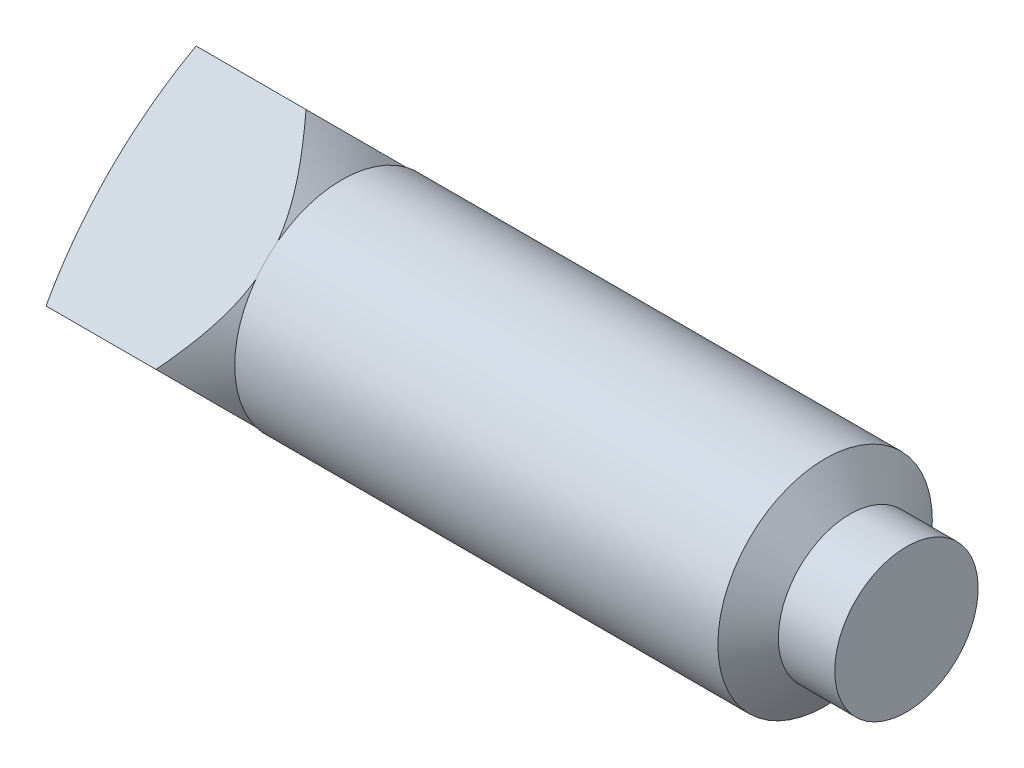
ISO-10303-21;
HEADER;
FILE_DESCRIPTION(('STEP AP214'),'2;1');
FILE_NAME('part.step','',(''),(''),'','','');
FILE_SCHEMA(('AUTOMOTIVE_DESIGN { 1 0 10303 214 1 1 1 1 }'));
ENDSEC;
DATA;
#1=APPLICATION_CONTEXT('core data for automotive mechanical design processes');
#2=APPLICATION_PROTOCOL_DEFINITION('international standard','automotive_design',2000,#1);
#3=PRODUCT_CONTEXT('',#1,'mechanical');
#4=PRODUCT('Part','Part','',(#3));
#5=PRODUCT_RELATED_PRODUCT_CATEGORY('part','',(#4));
#6=PRODUCT_DEFINITION_FORMATION('','',#4);
#7=PRODUCT_DEFINITION_CONTEXT('part definition',#1,'design');
#8=PRODUCT_DEFINITION('design','',#6,#7);
#9=PRODUCT_DEFINITION_SHAPE('','',#8);
#10=(LENGTH_UNIT() NAMED_UNIT(*) SI_UNIT(.MILLI.,.METRE.));
#11=(NAMED_UNIT(*) PLANE_ANGLE_UNIT() SI_UNIT($,.RADIAN.));
#12=(NAMED_UNIT(*) SI_UNIT($,.STERADIAN.) SOLID_ANGLE_UNIT());
#13=UNCERTAINTY_MEASURE_WITH_UNIT(LENGTH_MEASURE(1.E-05),#10,'distance_accuracy_value','');
#14=(GEOMETRIC_REPRESENTATION_CONTEXT(3) GLOBAL_UNCERTAINTY_ASSIGNED_CONTEXT((#13)) GLOBAL_UNIT_ASSIGNED_CONTEXT((#10,
#11,#12)) REPRESENTATION_CONTEXT('',''));
#15=CARTESIAN_POINT('',(0.,0.,0.));
#16=DIRECTION('',(0.,0.,1.));
#17=DIRECTION('',(1.,0.,0.));
#18=AXIS2_PLACEMENT_3D('',#15,#16,#17);
#19=CARTESIAN_POINT('',(-3.7592,0.,-3.376576301522));
#20=DIRECTION('',(0.,-0.707106781186549,0.707106781186546));
#21=DIRECTION('',(0.,-0.707106781186546,-0.707106781186549));
#22=AXIS2_PLACEMENT_3D('',#19,#20,#21);
#23=PLANE('',#22);
#24=CARTESIAN_POINT('',(-3.71463670391965,-2.84404188134766,-6.22061818286968));
#25=CARTESIAN_POINT('',(-3.55613835738031,-2.7014684863289,-6.07804478785091));
#26=CARTESIAN_POINT('',(-3.3981461725614,-2.55860959219922,-5.93518589372124));
#27=CARTESIAN_POINT('',(-3.08363247371533,-2.27203984223068,-5.64861614375269));
#28=CARTESIAN_POINT('',(-2.92711125800507,-2.12832882282158,-5.50490512434359));
#29=CARTESIAN_POINT('',(-2.61537743727245,-1.83919610910249,-5.2157724106245));
#30=CARTESIAN_POINT('',(-2.46017361078745,-1.69376967166462,-5.07034597318663));
#31=CARTESIAN_POINT('',(-2.15261018150915,-1.40143979481068,-4.77801609633269));
#32=CARTESIAN_POINT('',(-2.00025026783184,-1.25453651956937,-4.63111282109139));
#33=CARTESIAN_POINT('',(-1.72970912218957,-0.988182083810127,-4.36475838533214));
#34=CARTESIAN_POINT('',(-1.6107818963044,-0.869111186157921,-4.24568748767993));
#35=CARTESIAN_POINT('',(-1.37665028006823,-0.629105226352269,-4.00568152787428));
#36=CARTESIAN_POINT('',(-1.2614467785999,-0.508169729132242,-3.88474603065425));
#37=CARTESIAN_POINT('',(-1.03648369877529,-0.263755950580114,-3.64033225210212));
#38=CARTESIAN_POINT('',(-0.92672420864868,-0.140277628082976,-3.51685392960498));
#39=CARTESIAN_POINT('',(-0.768411771757097,0.0475823268502128,-3.32899397467179));
#40=CARTESIAN_POINT('',(-0.716703508322019,0.110632006865489,-3.26594429465652));
#41=CARTESIAN_POINT('',(-0.615958235242697,0.237786165781802,-3.13879013574021));
#42=CARTESIAN_POINT('',(-0.566920935267894,0.301890529049748,-3.07468577247226));
#43=CARTESIAN_POINT('',(-0.470564396194465,0.433616769365347,-2.94295953215666));
#44=CARTESIAN_POINT('',(-0.423365899696167,0.501283129317186,-2.87529317220482));
#45=CARTESIAN_POINT('',(-0.333664681644449,0.638144262361111,-2.73843203916089));
#46=CARTESIAN_POINT('',(-0.291160483356159,0.707338546531602,-2.6692377549904));
#47=CARTESIAN_POINT('',(-0.21229503205601,0.847303910790577,-2.52927239073143));
#48=CARTESIAN_POINT('',(-0.175920709426421,0.918071262430309,-2.4585050390917));
#49=CARTESIAN_POINT('',(-0.110910569940002,1.06137320930863,-2.31520309221337));
#50=CARTESIAN_POINT('',(-0.0822720790273502,1.1339071844,-2.24266911712201));
#51=CARTESIAN_POINT('',(-0.0393755590361009,1.26582470943116,-2.11075159209084));
#52=CARTESIAN_POINT('',(-0.0233846612610308,1.3249242803964,-2.0516520211256));
#53=CARTESIAN_POINT('',(0.00161538214945519,1.44386018912426,-1.93271611239775));
#54=CARTESIAN_POINT('',(0.0106258990169595,1.50369637983728,-1.87287992168472));
#55=CARTESIAN_POINT('',(0.021092065218137,1.62355655088552,-1.75301975063648));
#56=CARTESIAN_POINT('',(0.0225662852538797,1.68357970456736,-1.69299659695464));
#57=CARTESIAN_POINT('',(0.0179155629650262,1.80348109631527,-1.57309520520673));
#58=CARTESIAN_POINT('',(0.0117896392073187,1.86335931466481,-1.51321698685719));
#59=CARTESIAN_POINT('',(-0.0100815229762292,1.99721927704997,-1.37935702447203));
#60=CARTESIAN_POINT('',(-0.0278264770273225,2.0710373829424,-1.3055389185796));
#61=CARTESIAN_POINT('',(-0.0730208692286304,2.21718932171448,-1.15938697980752));
#62=CARTESIAN_POINT('',(-0.100477023648013,2.28952209061009,-1.08705421091191));
#63=CARTESIAN_POINT('',(-0.147658550765419,2.39694211918635,-0.97963418233565));
#64=CARTESIAN_POINT('',(-0.164455634065146,2.43269379192945,-0.943882509592546));
#65=CARTESIAN_POINT('',(-0.199813441042728,2.50374093804669,-0.872835363475312));
#66=CARTESIAN_POINT('',(-0.218373328077738,2.5390366188918,-0.837539682630196));
#67=CARTESIAN_POINT('',(-0.257053416617419,2.60919264030523,-0.76738366121677));
#68=CARTESIAN_POINT('',(-0.277173505655796,2.64405301204262,-0.73252328947938));
#69=CARTESIAN_POINT('',(-0.318791320846267,2.71336326090944,-0.663213040612556));
#70=CARTESIAN_POINT('',(-0.340289202341572,2.74781309123005,-0.628763210291943));
#71=CARTESIAN_POINT('',(-0.403215402660216,2.84534321177683,-0.53123308974517));
#72=CARTESIAN_POINT('',(-0.446099723650993,2.90795472792718,-0.468621573594819));
#73=CARTESIAN_POINT('',(-0.535121543723205,3.0320152226666,-0.344561078855395));
#74=CARTESIAN_POINT('',(-0.581259746295179,3.09346394619477,-0.283112355327228));
#75=CARTESIAN_POINT('',(-0.723571645103524,3.27639274740935,-0.100183554112644));
#76=CARTESIAN_POINT('',(-0.823588743807233,3.39637526634611,0.0197989648241122));
#77=CARTESIAN_POINT('',(-1.03047356134526,3.63375592705897,0.257179625536972));
#78=CARTESIAN_POINT('',(-1.13735948771658,3.75114599014641,0.374569688624415));
#79=CARTESIAN_POINT('',(-1.35557896678493,3.9837660355182,0.607189733996207));
#80=CARTESIAN_POINT('',(-1.4669107776858,4.09899683825346,0.722420536731465));
#81=CARTESIAN_POINT('',(-1.69305612145307,4.3282350269933,0.951658725471309));
#82=CARTESIAN_POINT('',(-1.8078789629881,4.44223779677309,1.06566149525109));
#83=CARTESIAN_POINT('',(-2.03983717113582,4.66907271742696,1.29249641590497));
#84=CARTESIAN_POINT('',(-2.1569727351054,4.78190476713299,1.405328465611));
#85=CARTESIAN_POINT('',(-2.39279712471298,5.00650286499349,1.6299265634715));
#86=CARTESIAN_POINT('',(-2.51148349733182,5.11827020377589,1.7416939022539));
#87=CARTESIAN_POINT('',(-2.75017246375155,5.34109999204909,1.9645236905271));
#88=CARTESIAN_POINT('',(-2.87017506440569,5.45216243786494,2.07558613634295));
#89=CARTESIAN_POINT('',(-3.05068333501779,5.61808795816659,2.2415116566446));
#90=CARTESIAN_POINT('',(-3.11080136898793,5.67316227632004,2.29658597479806));
#91=CARTESIAN_POINT('',(-3.23127854688802,5.78319708269411,2.40662078117212));
#92=CARTESIAN_POINT('',(-3.29163773795283,5.83815754511766,2.46158124359567));
#93=CARTESIAN_POINT('',(-3.41233885436048,5.94776482135319,2.5711885198312));
#94=CARTESIAN_POINT('',(-3.47268003281208,6.00241204656935,2.62583574504737));
#95=CARTESIAN_POINT('',(-3.59353260813616,6.11159399323992,2.73501769171794));
#96=CARTESIAN_POINT('',(-3.65404396700814,6.16612873572371,2.78955243420173));
#97=CARTESIAN_POINT('',(-3.71463670391965,6.22061818286967,2.84404188134769));
#98=B_SPLINE_CURVE_WITH_KNOTS('',3,(#24,#25,#26,#27,#28,#29,#30,#31,#32,#33,#34,#35,#36,#37,#38,
#39,#40,#41,#42,#43,#44,#45,#46,#47,#48,#49,#50,#51,#52,#53,#54,#55,#56,#57,#58,#59,#60,#61,#62,
#63,#64,#65,#66,#67,#68,#69,#70,#71,#72,#73,#74,#75,#76,#77,#78,#79,#80,#81,#82,#83,#84,#85,#86,
#87,#88,#89,#90,#91,#92,#93,#94,#95,#96,#97),.UNSPECIFIED.,.F.,.F.,(4,2,2,2,2,2,2,2,2,2,2,2,2,2,
2,2,2,2,2,2,2,2,2,2,2,2,2,2,2,2,2,2,2,2,2,2,4),(0.,0.769411594985047,1.53897600020603,
2.31192373762504,3.08478647901891,3.70321119591575,4.32178246157398,4.94036374898194,
5.24955145783678,5.55870549100784,5.87871228162845,6.19861811586593,6.51783299840494,
6.83693739586921,7.0919662684174,7.3469450301599,7.60129517747026,7.8556781733224,
8.17279662746614,8.49013483105985,8.64994152137471,8.80967274140049,8.96939245797432,
9.12913021439977,9.42418817492744,9.71931012383282,10.3099299987715,10.9021857726158,
11.4942117478058,12.0879855523368,12.6818102476394,13.2747881880489,13.8677692174057,
14.1629380958073,14.4581678026877,14.7523159011579,15.0464028402099),.UNSPECIFIED.);
#99=CARTESIAN_POINT('',(-0.808536519218278,0.,-3.376576301522));
#100=VERTEX_POINT('',#99);
#101=CARTESIAN_POINT('',(0.,1.44137193015166,-1.93520437137034));
#102=VERTEX_POINT('',#101);
#103=EDGE_CURVE('E159',#100,#102,#98,.T.);
#104=ORIENTED_EDGE('',*,*,#103,.F.);
#105=DIRECTION('',(1.,0.,0.));
#106=VECTOR('',#105,1.);
#107=CARTESIAN_POINT('',(-3.7592,0.,-3.376576301522));
#108=LINE('',#107,#106);
#109=CARTESIAN_POINT('',(-3.2823012150984,0.,-3.376576301522));
#110=VERTEX_POINT('',#109);
#111=EDGE_CURVE('E140',#110,#100,#108,.T.);
#112=ORIENTED_EDGE('',*,*,#111,.F.);
#113=CARTESIAN_POINT('',(8.4328,1.688288150761,-1.688288150761));
#114=DIRECTION('',(0.,-0.707106781186549,0.707106781186546));
#115=DIRECTION('',(0.,-0.707106781186546,-0.707106781186549));
#116=AXIS2_PLACEMENT_3D('',#113,#114,#115);
#117=CIRCLE('',#116,11.9559286648926);
#118=CARTESIAN_POINT('',(-3.2823012150984,3.376576301522,0.));
#119=VERTEX_POINT('',#118);
#120=EDGE_CURVE('E149',#119,#110,#117,.T.);
#121=ORIENTED_EDGE('',*,*,#120,.F.);
#122=DIRECTION('',(1.,0.,0.));
#123=VECTOR('',#122,1.);
#124=CARTESIAN_POINT('',(-3.7592,3.376576301522,0.));
#125=LINE('',#124,#123);
#126=CARTESIAN_POINT('',(-0.808536519218278,3.376576301522,0.));
#127=VERTEX_POINT('',#126);
#128=EDGE_CURVE('E147',#119,#127,#125,.T.);
#129=ORIENTED_EDGE('',*,*,#128,.T.);
#130=CARTESIAN_POINT('',(0.,1.93520437137034,-1.44137193015166));
#131=VERTEX_POINT('',#130);
#132=EDGE_CURVE('E169',#131,#127,#98,.T.);
#133=ORIENTED_EDGE('',*,*,#132,.F.);
#134=DIRECTION('',(0.,-0.707106781186546,-0.707106781186549));
#135=VECTOR('',#134,1.);
#136=CARTESIAN_POINT('',(0.,0.,-3.376576301522));
#137=LINE('',#136,#135);
#138=EDGE_CURVE('E40',#131,#102,#137,.T.);
#139=ORIENTED_EDGE('',*,*,#138,.T.);
#140=EDGE_LOOP('',(#104,#112,#121,#129,#133,#139));
#141=FACE_BOUND('',#140,.T.);
#142=ADVANCED_FACE('F32',(#141),#23,.F.);
#143=CARTESIAN_POINT('',(-3.7592,0.,-3.376576301522));
#144=DIRECTION('',(0.,0.707106781186546,0.707106781186549));
#145=DIRECTION('',(0.,-0.707106781186549,0.707106781186546));
#146=AXIS2_PLACEMENT_3D('',#143,#144,#145);
#147=PLANE('',#146);
#148=CARTESIAN_POINT('',(-3.71463670391965,-6.22061818286968,2.84404188134766));
#149=CARTESIAN_POINT('',(-3.55613835738031,-6.07804478785091,2.7014684863289));
#150=CARTESIAN_POINT('',(-3.3981461725614,-5.93518589372124,2.55860959219923));
#151=CARTESIAN_POINT('',(-3.08363247371533,-5.64861614375269,2.27203984223068));
#152=CARTESIAN_POINT('',(-2.92711125800507,-5.50490512434359,2.12832882282158));
#153=CARTESIAN_POINT('',(-2.61537743727245,-5.2157724106245,1.83919610910249));
#154=CARTESIAN_POINT('',(-2.46017361078745,-5.07034597318663,1.69376967166462));
#155=CARTESIAN_POINT('',(-2.15261018150915,-4.77801609633269,1.40143979481068));
#156=CARTESIAN_POINT('',(-2.00025026783184,-4.63111282109139,1.25453651956937));
#157=CARTESIAN_POINT('',(-1.72970912218957,-4.36475838533214,0.988182083810127));
#158=CARTESIAN_POINT('',(-1.6107818963044,-4.24568748767993,0.869111186157921));
#159=CARTESIAN_POINT('',(-1.37665028006823,-4.00568152787428,0.629105226352268));
#160=CARTESIAN_POINT('',(-1.2614467785999,-3.88474603065425,0.508169729132241));
#161=CARTESIAN_POINT('',(-1.03648369877529,-3.64033225210212,0.263755950580114));
#162=CARTESIAN_POINT('',(-0.92672420864868,-3.51685392960498,0.140277628082975));
#163=CARTESIAN_POINT('',(-0.768411771757097,-3.32899397467179,-0.0475823268502131));
#164=CARTESIAN_POINT('',(-0.716703508322019,-3.26594429465652,-0.11063200686549));
#165=CARTESIAN_POINT('',(-0.615958235242697,-3.13879013574021,-0.237786165781802));
#166=CARTESIAN_POINT('',(-0.566920935267894,-3.07468577247226,-0.301890529049748));
#167=CARTESIAN_POINT('',(-0.470564396194465,-2.94295953215666,-0.433616769365348));
#168=CARTESIAN_POINT('',(-0.423365899696167,-2.87529317220482,-0.501283129317186));
#169=CARTESIAN_POINT('',(-0.333664681644449,-2.73843203916089,-0.638144262361111));
#170=CARTESIAN_POINT('',(-0.291160483356159,-2.6692377549904,-0.707338546531602));
#171=CARTESIAN_POINT('',(-0.21229503205601,-2.52927239073143,-0.847303910790577));
#172=CARTESIAN_POINT('',(-0.175920709426422,-2.4585050390917,-0.918071262430309));
#173=CARTESIAN_POINT('',(-0.110910569940002,-2.31520309221337,-1.06137320930863));
#174=CARTESIAN_POINT('',(-0.0822720790273506,-2.24266911712201,-1.1339071844));
#175=CARTESIAN_POINT('',(-0.0393755590361008,-2.11075159209084,-1.26582470943116));
#176=CARTESIAN_POINT('',(-0.0233846612610302,-2.0516520211256,-1.3249242803964));
#177=CARTESIAN_POINT('',(0.00161538214945554,-1.93271611239775,-1.44386018912426));
#178=CARTESIAN_POINT('',(0.0106258990169592,-1.87287992168472,-1.50369637983728));
#179=CARTESIAN_POINT('',(0.0210920652181363,-1.75301975063648,-1.62355655088552));
#180=CARTESIAN_POINT('',(0.0225662852538793,-1.69299659695464,-1.68357970456736));
#181=CARTESIAN_POINT('',(0.0179155629650258,-1.57309520520673,-1.80348109631527));
#182=CARTESIAN_POINT('',(0.0117896392073179,-1.51321698685719,-1.86335931466481));
#183=CARTESIAN_POINT('',(-0.01008152297623,-1.37935702447203,-1.99721927704998));
#184=CARTESIAN_POINT('',(-0.0278264770273229,-1.3055389185796,-2.0710373829424));
#185=CARTESIAN_POINT('',(-0.0730208692286305,-1.15938697980752,-2.21718932171448));
#186=CARTESIAN_POINT('',(-0.100477023648013,-1.08705421091191,-2.28952209061009));
#187=CARTESIAN_POINT('',(-0.14765855076542,-0.97963418233565,-2.39694211918635));
#188=CARTESIAN_POINT('',(-0.164455634065146,-0.943882509592546,-2.43269379192945));
#189=CARTESIAN_POINT('',(-0.199813441042728,-0.872835363475312,-2.50374093804669));
#190=CARTESIAN_POINT('',(-0.218373328077739,-0.837539682630195,-2.5390366188918));
#191=CARTESIAN_POINT('',(-0.25705341661742,-0.767383661216768,-2.60919264030523));
#192=CARTESIAN_POINT('',(-0.277173505655796,-0.732523289479379,-2.64405301204262));
#193=CARTESIAN_POINT('',(-0.318791320846268,-0.663213040612556,-2.71336326090944));
#194=CARTESIAN_POINT('',(-0.340289202341573,-0.628763210291943,-2.74781309123006));
#195=CARTESIAN_POINT('',(-0.403215402660216,-0.53123308974517,-2.84534321177683));
#196=CARTESIAN_POINT('',(-0.446099723650993,-0.46862157359482,-2.90795472792718));
#197=CARTESIAN_POINT('',(-0.535121543723204,-0.344561078855395,-3.0320152226666));
#198=CARTESIAN_POINT('',(-0.581259746295178,-0.283112355327229,-3.09346394619477));
#199=CARTESIAN_POINT('',(-0.723571645103523,-0.100183554112645,-3.27639274740935));
#200=CARTESIAN_POINT('',(-0.823588743807233,0.0197989648241119,-3.39637526634611));
#201=CARTESIAN_POINT('',(-1.03047356134526,0.257179625536973,-3.63375592705897));
#202=CARTESIAN_POINT('',(-1.13735948771658,0.374569688624416,-3.75114599014641));
#203=CARTESIAN_POINT('',(-1.35557896678493,0.607189733996208,-3.9837660355182));
#204=CARTESIAN_POINT('',(-1.4669107776858,0.722420536731466,-4.09899683825346));
#205=CARTESIAN_POINT('',(-1.69305612145307,0.951658725471309,-4.3282350269933));
#206=CARTESIAN_POINT('',(-1.8078789629881,1.0656614952511,-4.44223779677309));
#207=CARTESIAN_POINT('',(-2.03983717113582,1.29249641590497,-4.66907271742696));
#208=CARTESIAN_POINT('',(-2.1569727351054,1.405328465611,-4.78190476713299));
#209=CARTESIAN_POINT('',(-2.39279712471298,1.6299265634715,-5.00650286499349));
#210=CARTESIAN_POINT('',(-2.51148349733182,1.7416939022539,-5.11827020377589));
#211=CARTESIAN_POINT('',(-2.75017246375155,1.9645236905271,-5.34109999204909));
#212=CARTESIAN_POINT('',(-2.87017506440569,2.07558613634295,-5.45216243786494));
#213=CARTESIAN_POINT('',(-3.05068333501779,2.2415116566446,-5.61808795816659));
#214=CARTESIAN_POINT('',(-3.11080136898793,2.29658597479806,-5.67316227632004));
#215=CARTESIAN_POINT('',(-3.23127854688802,2.40662078117212,-5.78319708269411));
#216=CARTESIAN_POINT('',(-3.29163773795283,2.46158124359567,-5.83815754511766));
#217=CARTESIAN_POINT('',(-3.41233885436048,2.5711885198312,-5.94776482135319));
#218=CARTESIAN_POINT('',(-3.47268003281208,2.62583574504737,-6.00241204656935));
#219=CARTESIAN_POINT('',(-3.59353260813616,2.73501769171794,-6.11159399323992));
#220=CARTESIAN_POINT('',(-3.65404396700814,2.78955243420173,-6.16612873572371));
#221=CARTESIAN_POINT('',(-3.71463670391965,2.84404188134769,-6.22061818286967));
#222=B_SPLINE_CURVE_WITH_KNOTS('',3,(#148,#149,#150,#151,#152,#153,#154,#155,#156,#157,#158,
#159,#160,#161,#162,#163,#164,#165,#166,#167,#168,#169,#170,#171,#172,#173,#174,#175,#176,#177,
#178,#179,#180,#181,#182,#183,#184,#185,#186,#187,#188,#189,#190,#191,#192,#193,#194,#195,#196,
#197,#198,#199,#200,#201,#202,#203,#204,#205,#206,#207,#208,#209,#210,#211,#212,#213,#214,#215,
#216,#217,#218,#219,#220,#221),.UNSPECIFIED.,.F.,.F.,(4,2,2,2,2,2,2,2,2,2,2,2,2,2,2,2,2,2,2,2,2,
2,2,2,2,2,2,2,2,2,2,2,2,2,2,2,4),(0.,0.769411594985047,1.53897600020603,2.31192373762504,
3.08478647901891,3.70321119591575,4.32178246157398,4.94036374898194,5.24955145783678,
5.55870549100784,5.87871228162845,6.19861811586593,6.51783299840494,6.83693739586921,
7.0919662684174,7.3469450301599,7.60129517747026,7.8556781733224,8.17279662746614,
8.49013483105985,8.64994152137472,8.80967274140049,8.96939245797432,9.12913021439978,
9.42418817492744,9.71931012383282,10.3099299987715,10.9021857726158,11.4942117478058,
12.0879855523368,12.6818102476394,13.2747881880489,13.8677692174057,14.1629380958073,
14.4581678026877,14.7523159011579,15.0464028402099),.UNSPECIFIED.);
#223=CARTESIAN_POINT('',(-0.808536519218278,-3.376576301522,0.));
#224=VERTEX_POINT('',#223);
#225=CARTESIAN_POINT('',(0.,-1.93520437137034,-1.44137193015166));
#226=VERTEX_POINT('',#225);
#227=EDGE_CURVE('E160',#224,#226,#222,.T.);
#228=ORIENTED_EDGE('',*,*,#227,.F.);
#229=DIRECTION('',(1.,0.,0.));
#230=VECTOR('',#229,1.);
#231=CARTESIAN_POINT('',(-3.7592,-3.376576301522,0.));
#232=LINE('',#231,#230);
#233=CARTESIAN_POINT('',(-3.2823012150984,-3.376576301522,0.));
#234=VERTEX_POINT('',#233);
#235=EDGE_CURVE('E143',#234,#224,#232,.T.);
#236=ORIENTED_EDGE('',*,*,#235,.F.);
#237=CARTESIAN_POINT('',(8.4328,-1.688288150761,-1.688288150761));
#238=DIRECTION('',(0.,0.707106781186546,0.707106781186549));
#239=DIRECTION('',(0.,-0.707106781186549,0.707106781186546));
#240=AXIS2_PLACEMENT_3D('',#237,#238,#239);
#241=CIRCLE('',#240,11.9559286648926);
#242=EDGE_CURVE('E156',#110,#234,#241,.T.);
#243=ORIENTED_EDGE('',*,*,#242,.F.);
#244=ORIENTED_EDGE('',*,*,#111,.T.);
#245=CARTESIAN_POINT('',(0.,-1.44137193015166,-1.93520437137034));
#246=VERTEX_POINT('',#245);
#247=EDGE_CURVE('E167',#246,#100,#222,.T.);
#248=ORIENTED_EDGE('',*,*,#247,.F.);
#249=DIRECTION('',(0.,-0.707106781186549,0.707106781186546));
#250=VECTOR('',#249,1.);
#251=CARTESIAN_POINT('',(0.,0.,-3.376576301522));
#252=LINE('',#251,#250);
#253=EDGE_CURVE('E127',#246,#226,#252,.T.);
#254=ORIENTED_EDGE('',*,*,#253,.T.);
#255=EDGE_LOOP('',(#228,#236,#243,#244,#248,#254));
#256=FACE_BOUND('',#255,.T.);
#257=ADVANCED_FACE('F175',(#256),#147,.F.);
#258=CARTESIAN_POINT('',(-3.7592,-3.376576301522,0.));
#259=DIRECTION('',(0.,0.707106781186549,-0.707106781186546));
#260=DIRECTION('',(0.,0.707106781186546,0.707106781186549));
#261=AXIS2_PLACEMENT_3D('',#258,#259,#260);
#262=PLANE('',#261);
#263=CARTESIAN_POINT('',(-3.71463670391965,2.84404188134766,6.22061818286968));
#264=CARTESIAN_POINT('',(-3.55613835738031,2.70146848632889,6.07804478785091));
#265=CARTESIAN_POINT('',(-3.3981461725614,2.55860959219922,5.93518589372124));
#266=CARTESIAN_POINT('',(-3.08363247371533,2.27203984223068,5.64861614375269));
#267=CARTESIAN_POINT('',(-2.92711125800507,2.12832882282158,5.50490512434359));
#268=CARTESIAN_POINT('',(-2.61537743727245,1.83919610910249,5.2157724106245));
#269=CARTESIAN_POINT('',(-2.46017361078745,1.69376967166462,5.07034597318663));
#270=CARTESIAN_POINT('',(-2.15261018150915,1.40143979481067,4.77801609633269));
#271=CARTESIAN_POINT('',(-2.00025026783184,1.25453651956937,4.63111282109139));
#272=CARTESIAN_POINT('',(-1.72970912218957,0.988182083810127,4.36475838533214));
#273=CARTESIAN_POINT('',(-1.6107818963044,0.869111186157921,4.24568748767993));
#274=CARTESIAN_POINT('',(-1.37665028006823,0.629105226352269,4.00568152787428));
#275=CARTESIAN_POINT('',(-1.2614467785999,0.508169729132241,3.88474603065425));
#276=CARTESIAN_POINT('',(-1.03648369877529,0.263755950580114,3.64033225210212));
#277=CARTESIAN_POINT('',(-0.926724208648679,0.140277628082975,3.51685392960498));
#278=CARTESIAN_POINT('',(-0.768411771757096,-0.0475823268502135,3.32899397467179));
#279=CARTESIAN_POINT('',(-0.716703508322018,-0.11063200686549,3.26594429465652));
#280=CARTESIAN_POINT('',(-0.615958235242696,-0.237786165781802,3.1387901357402));
#281=CARTESIAN_POINT('',(-0.566920935267893,-0.301890529049749,3.07468577247226));
#282=CARTESIAN_POINT('',(-0.470564396194464,-0.433616769365348,2.94295953215666));
#283=CARTESIAN_POINT('',(-0.423365899696167,-0.501283129317187,2.87529317220482));
#284=CARTESIAN_POINT('',(-0.333664681644448,-0.638144262361113,2.73843203916089));
#285=CARTESIAN_POINT('',(-0.291160483356158,-0.707338546531603,2.6692377549904));
#286=CARTESIAN_POINT('',(-0.212295032056009,-0.847303910790578,2.52927239073143));
#287=CARTESIAN_POINT('',(-0.175920709426421,-0.91807126243031,2.4585050390917));
#288=CARTESIAN_POINT('',(-0.110910569940002,-1.06137320930863,2.31520309221337));
#289=CARTESIAN_POINT('',(-0.0822720790273505,-1.1339071844,2.24266911712201));
#290=CARTESIAN_POINT('',(-0.0393755590361012,-1.26582470943116,2.11075159209084));
#291=CARTESIAN_POINT('',(-0.0233846612610307,-1.3249242803964,2.0516520211256));
#292=CARTESIAN_POINT('',(0.00161538214945534,-1.44386018912426,1.93271611239775));
#293=CARTESIAN_POINT('',(0.0106258990169595,-1.50369637983728,1.87287992168472));
#294=CARTESIAN_POINT('',(0.0210920652181365,-1.62355655088552,1.75301975063648));
#295=CARTESIAN_POINT('',(0.0225662852538791,-1.68357970456736,1.69299659695464));
#296=CARTESIAN_POINT('',(0.0179155629650254,-1.80348109631527,1.57309520520673));
#297=CARTESIAN_POINT('',(0.0117896392073179,-1.86335931466481,1.51321698685719));
#298=CARTESIAN_POINT('',(-0.0100815229762297,-1.99721927704998,1.37935702447203));
#299=CARTESIAN_POINT('',(-0.0278264770273227,-2.0710373829424,1.3055389185796));
#300=CARTESIAN_POINT('',(-0.0730208692286305,-2.21718932171448,1.15938697980752));
#301=CARTESIAN_POINT('',(-0.100477023648013,-2.28952209061009,1.08705421091191));
#302=CARTESIAN_POINT('',(-0.14765855076542,-2.39694211918635,0.979634182335649));
#303=CARTESIAN_POINT('',(-0.164455634065147,-2.43269379192945,0.943882509592545));
#304=CARTESIAN_POINT('',(-0.199813441042729,-2.50374093804669,0.872835363475312));
#305=CARTESIAN_POINT('',(-0.218373328077739,-2.5390366188918,0.837539682630195));
#306=CARTESIAN_POINT('',(-0.257053416617421,-2.60919264030523,0.767383661216768));
#307=CARTESIAN_POINT('',(-0.277173505655797,-2.64405301204262,0.732523289479378));
#308=CARTESIAN_POINT('',(-0.318791320846268,-2.71336326090944,0.663213040612555));
#309=CARTESIAN_POINT('',(-0.340289202341573,-2.74781309123006,0.628763210291942));
#310=CARTESIAN_POINT('',(-0.403215402660217,-2.84534321177683,0.531233089745169));
#311=CARTESIAN_POINT('',(-0.446099723650993,-2.90795472792718,0.468621573594818));
#312=CARTESIAN_POINT('',(-0.535121543723206,-3.0320152226666,0.344561078855393));
#313=CARTESIAN_POINT('',(-0.58125974629518,-3.09346394619477,0.283112355327227));
#314=CARTESIAN_POINT('',(-0.723571645103525,-3.27639274740935,0.100183554112643));
#315=CARTESIAN_POINT('',(-0.823588743807235,-3.39637526634611,-0.019798964824114));
#316=CARTESIAN_POINT('',(-1.03047356134526,-3.63375592705897,-0.257179625536975));
#317=CARTESIAN_POINT('',(-1.13735948771658,-3.75114599014641,-0.374569688624418));
#318=CARTESIAN_POINT('',(-1.35557896678493,-3.98376603551821,-0.607189733996212));
#319=CARTESIAN_POINT('',(-1.4669107776858,-4.09899683825346,-0.72242053673147));
#320=CARTESIAN_POINT('',(-1.69305612145307,-4.32823502699331,-0.951658725471313));
#321=CARTESIAN_POINT('',(-1.80787896298811,-4.44223779677309,-1.0656614952511));
#322=CARTESIAN_POINT('',(-2.03983717113582,-4.66907271742697,-1.29249641590498));
#323=CARTESIAN_POINT('',(-2.1569727351054,-4.78190476713299,-1.405328465611));
#324=CARTESIAN_POINT('',(-2.39279712471299,-5.0065028649935,-1.62992656347151));
#325=CARTESIAN_POINT('',(-2.51148349733183,-5.11827020377589,-1.74169390225391));
#326=CARTESIAN_POINT('',(-2.75017246375156,-5.3410999920491,-1.96452369052711));
#327=CARTESIAN_POINT('',(-2.8701750644057,-5.45216243786495,-2.07558613634296));
#328=CARTESIAN_POINT('',(-3.05068333501779,-5.6180879581666,-2.24151165664461));
#329=CARTESIAN_POINT('',(-3.11080136898793,-5.67316227632005,-2.29658597479806));
#330=CARTESIAN_POINT('',(-3.23127854688803,-5.78319708269411,-2.40662078117212));
#331=CARTESIAN_POINT('',(-3.29163773795283,-5.83815754511766,-2.46158124359568));
#332=CARTESIAN_POINT('',(-3.41233885436048,-5.94776482135319,-2.57118851983121));
#333=CARTESIAN_POINT('',(-3.47268003281208,-6.00241204656936,-2.62583574504737));
#334=CARTESIAN_POINT('',(-3.59353260813617,-6.11159399323992,-2.73501769171794));
#335=CARTESIAN_POINT('',(-3.65404396700814,-6.16612873572371,-2.78955243420173));
#336=CARTESIAN_POINT('',(-3.71463670391965,-6.22061818286967,-2.84404188134769));
#337=B_SPLINE_CURVE_WITH_KNOTS('',3,(#263,#264,#265,#266,#267,#268,#269,#270,#271,#272,#273,
#274,#275,#276,#277,#278,#279,#280,#281,#282,#283,#284,#285,#286,#287,#288,#289,#290,#291,#292,
#293,#294,#295,#296,#297,#298,#299,#300,#301,#302,#303,#304,#305,#306,#307,#308,#309,#310,#311,
#312,#313,#314,#315,#316,#317,#318,#319,#320,#321,#322,#323,#324,#325,#326,#327,#328,#329,#330,
#331,#332,#333,#334,#335,#336),.UNSPECIFIED.,.F.,.F.,(4,2,2,2,2,2,2,2,2,2,2,2,2,2,2,2,2,2,2,2,2,
2,2,2,2,2,2,2,2,2,2,2,2,2,2,2,4),(0.,0.769411594985047,1.53897600020603,2.31192373762504,
3.08478647901891,3.70321119591575,4.32178246157398,4.94036374898194,5.24955145783678,
5.55870549100784,5.87871228162846,6.19861811586593,6.51783299840494,6.83693739586921,
7.0919662684174,7.34694503015991,7.60129517747026,7.8556781733224,8.17279662746614,
8.49013483105985,8.64994152137472,8.80967274140049,8.96939245797432,9.12913021439978,
9.42418817492744,9.71931012383283,10.3099299987715,10.9021857726158,11.4942117478058,
12.0879855523368,12.6818102476394,13.2747881880489,13.8677692174058,14.1629380958074,
14.4581678026877,14.7523159011579,15.0464028402099),.UNSPECIFIED.);
#338=CARTESIAN_POINT('',(-0.808536519218278,0.,3.376576301522));
#339=VERTEX_POINT('',#338);
#340=CARTESIAN_POINT('',(0.,-1.44137193015166,1.93520437137034));
#341=VERTEX_POINT('',#340);
#342=EDGE_CURVE('E54',#339,#341,#337,.T.);
#343=ORIENTED_EDGE('',*,*,#342,.F.);
#344=DIRECTION('',(1.,0.,0.));
#345=VECTOR('',#344,1.);
#346=CARTESIAN_POINT('',(-3.7592,0.,3.376576301522));
#347=LINE('',#346,#345);
#348=CARTESIAN_POINT('',(-3.2823012150984,0.,3.376576301522));
#349=VERTEX_POINT('',#348);
#350=EDGE_CURVE('E115',#349,#339,#347,.T.);
#351=ORIENTED_EDGE('',*,*,#350,.F.);
#352=CARTESIAN_POINT('',(8.4328,-1.688288150761,1.688288150761));
#353=DIRECTION('',(0.,0.707106781186549,-0.707106781186546));
#354=DIRECTION('',(0.,0.707106781186546,0.707106781186549));
#355=AXIS2_PLACEMENT_3D('',#352,#353,#354);
#356=CIRCLE('',#355,11.9559286648926);
#357=EDGE_CURVE('E46',#234,#349,#356,.T.);
#358=ORIENTED_EDGE('',*,*,#357,.F.);
#359=ORIENTED_EDGE('',*,*,#235,.T.);
#360=CARTESIAN_POINT('',(0.,-1.93520437137034,1.44137193015166));
#361=VERTEX_POINT('',#360);
#362=EDGE_CURVE('E168',#361,#224,#337,.T.);
#363=ORIENTED_EDGE('',*,*,#362,.F.);
#364=DIRECTION('',(0.,0.707106781186546,0.707106781186549));
#365=VECTOR('',#364,1.);
#366=CARTESIAN_POINT('',(0.,-3.376576301522,0.));
#367=LINE('',#366,#365);
#368=EDGE_CURVE('E121',#361,#341,#367,.T.);
#369=ORIENTED_EDGE('',*,*,#368,.T.);
#370=EDGE_LOOP('',(#343,#351,#358,#359,#363,#369));
#371=FACE_BOUND('',#370,.T.);
#372=ADVANCED_FACE('F196',(#371),#262,.F.);
#373=CARTESIAN_POINT('',(-3.7592,3.376576301522,0.));
#374=DIRECTION('',(0.,-0.707106781186546,-0.707106781186549));
#375=DIRECTION('',(0.,0.707106781186549,-0.707106781186546));
#376=AXIS2_PLACEMENT_3D('',#373,#374,#375);
#377=PLANE('',#376);
#378=CARTESIAN_POINT('',(-3.71463670391965,6.22061818286968,-2.84404188134766));
#379=CARTESIAN_POINT('',(-3.55613835738031,6.07804478785091,-2.70146848632889));
#380=CARTESIAN_POINT('',(-3.3981461725614,5.93518589372124,-2.55860959219922));
#381=CARTESIAN_POINT('',(-3.08363247371533,5.64861614375269,-2.27203984223068));
#382=CARTESIAN_POINT('',(-2.92711125800507,5.50490512434359,-2.12832882282158));
#383=CARTESIAN_POINT('',(-2.61537743727245,5.2157724106245,-1.83919610910249));
#384=CARTESIAN_POINT('',(-2.46017361078745,5.07034597318663,-1.69376967166462));
#385=CARTESIAN_POINT('',(-2.15261018150916,4.77801609633269,-1.40143979481068));
#386=CARTESIAN_POINT('',(-2.00025026783184,4.63111282109139,-1.25453651956937));
#387=CARTESIAN_POINT('',(-1.72970912218957,4.36475838533214,-0.988182083810127));
#388=CARTESIAN_POINT('',(-1.6107818963044,4.24568748767993,-0.869111186157921));
#389=CARTESIAN_POINT('',(-1.37665028006823,4.00568152787428,-0.629105226352269));
#390=CARTESIAN_POINT('',(-1.2614467785999,3.88474603065425,-0.508169729132241));
#391=CARTESIAN_POINT('',(-1.03648369877529,3.64033225210212,-0.263755950580114));
#392=CARTESIAN_POINT('',(-0.926724208648679,3.51685392960498,-0.140277628082975));
#393=CARTESIAN_POINT('',(-0.768411771757096,3.32899397467179,0.0475823268502137));
#394=CARTESIAN_POINT('',(-0.716703508322018,3.26594429465652,0.110632006865491));
#395=CARTESIAN_POINT('',(-0.615958235242696,3.1387901357402,0.237786165781803));
#396=CARTESIAN_POINT('',(-0.566920935267893,3.07468577247226,0.301890529049749));
#397=CARTESIAN_POINT('',(-0.470564396194464,2.94295953215666,0.433616769365348));
#398=CARTESIAN_POINT('',(-0.423365899696167,2.87529317220482,0.501283129317187));
#399=CARTESIAN_POINT('',(-0.333664681644448,2.73843203916089,0.638144262361112));
#400=CARTESIAN_POINT('',(-0.291160483356158,2.6692377549904,0.707338546531603));
#401=CARTESIAN_POINT('',(-0.212295032056009,2.52927239073143,0.847303910790578));
#402=CARTESIAN_POINT('',(-0.175920709426421,2.45850503909169,0.91807126243031));
#403=CARTESIAN_POINT('',(-0.110910569940001,2.31520309221337,1.06137320930863));
#404=CARTESIAN_POINT('',(-0.0822720790273496,2.24266911712201,1.1339071844));
#405=CARTESIAN_POINT('',(-0.0393755590361004,2.11075159209084,1.26582470943116));
#406=CARTESIAN_POINT('',(-0.0233846612610304,2.0516520211256,1.3249242803964));
#407=CARTESIAN_POINT('',(0.00161538214945541,1.93271611239775,1.44386018912426));
#408=CARTESIAN_POINT('',(0.0106258990169596,1.87287992168472,1.50369637983728));
#409=CARTESIAN_POINT('',(0.0210920652181369,1.75301975063648,1.62355655088552));
#410=CARTESIAN_POINT('',(0.0225662852538796,1.69299659695464,1.68357970456736));
#411=CARTESIAN_POINT('',(0.0179155629650259,1.57309520520673,1.80348109631527));
#412=CARTESIAN_POINT('',(0.0117896392073183,1.51321698685719,1.86335931466481));
#413=CARTESIAN_POINT('',(-0.0100815229762296,1.37935702447203,1.99721927704998));
#414=CARTESIAN_POINT('',(-0.0278264770273229,1.3055389185796,2.0710373829424));
#415=CARTESIAN_POINT('',(-0.0730208692286305,1.15938697980752,2.21718932171448));
#416=CARTESIAN_POINT('',(-0.100477023648013,1.08705421091191,2.28952209061009));
#417=CARTESIAN_POINT('',(-0.14765855076542,0.979634182335649,2.39694211918635));
#418=CARTESIAN_POINT('',(-0.164455634065147,0.943882509592545,2.43269379192945));
#419=CARTESIAN_POINT('',(-0.199813441042729,0.872835363475311,2.50374093804669));
#420=CARTESIAN_POINT('',(-0.218373328077739,0.837539682630194,2.5390366188918));
#421=CARTESIAN_POINT('',(-0.25705341661742,0.767383661216768,2.60919264030523));
#422=CARTESIAN_POINT('',(-0.277173505655797,0.732523289479378,2.64405301204262));
#423=CARTESIAN_POINT('',(-0.318791320846268,0.663213040612555,2.71336326090944));
#424=CARTESIAN_POINT('',(-0.340289202341573,0.628763210291942,2.74781309123006));
#425=CARTESIAN_POINT('',(-0.403215402660217,0.531233089745169,2.84534321177683));
#426=CARTESIAN_POINT('',(-0.446099723650994,0.468621573594818,2.90795472792718));
#427=CARTESIAN_POINT('',(-0.535121543723206,0.344561078855393,3.0320152226666));
#428=CARTESIAN_POINT('',(-0.58125974629518,0.283112355327226,3.09346394619477));
#429=CARTESIAN_POINT('',(-0.723571645103525,0.100183554112641,3.27639274740935));
#430=CARTESIAN_POINT('',(-0.823588743807236,-0.0197989648241155,3.39637526634611));
#431=CARTESIAN_POINT('',(-1.03047356134526,-0.257179625536976,3.63375592705897));
#432=CARTESIAN_POINT('',(-1.13735948771658,-0.37456968862442,3.75114599014641));
#433=CARTESIAN_POINT('',(-1.35557896678493,-0.607189733996213,3.98376603551821));
#434=CARTESIAN_POINT('',(-1.4669107776858,-0.72242053673147,4.09899683825346));
#435=CARTESIAN_POINT('',(-1.69305612145307,-0.951658725471314,4.32823502699331));
#436=CARTESIAN_POINT('',(-1.80787896298811,-1.0656614952511,4.44223779677309));
#437=CARTESIAN_POINT('',(-2.03983717113582,-1.29249641590498,4.66907271742697));
#438=CARTESIAN_POINT('',(-2.1569727351054,-1.405328465611,4.78190476713299));
#439=CARTESIAN_POINT('',(-2.39279712471299,-1.62992656347151,5.0065028649935));
#440=CARTESIAN_POINT('',(-2.51148349733183,-1.74169390225391,5.1182702037759));
#441=CARTESIAN_POINT('',(-2.75017246375156,-1.96452369052711,5.3410999920491));
#442=CARTESIAN_POINT('',(-2.8701750644057,-2.07558613634296,5.45216243786495));
#443=CARTESIAN_POINT('',(-3.0506833350178,-2.24151165664461,5.6180879581666));
#444=CARTESIAN_POINT('',(-3.11080136898793,-2.29658597479806,5.67316227632005));
#445=CARTESIAN_POINT('',(-3.23127854688803,-2.40662078117213,5.78319708269411));
#446=CARTESIAN_POINT('',(-3.29163773795283,-2.46158124359568,5.83815754511766));
#447=CARTESIAN_POINT('',(-3.41233885436048,-2.57118851983121,5.94776482135319));
#448=CARTESIAN_POINT('',(-3.47268003281208,-2.62583574504737,6.00241204656936));
#449=CARTESIAN_POINT('',(-3.59353260813617,-2.73501769171794,6.11159399323992));
#450=CARTESIAN_POINT('',(-3.65404396700814,-2.78955243420173,6.16612873572371));
#451=CARTESIAN_POINT('',(-3.71463670391965,-2.84404188134769,6.22061818286967));
#452=B_SPLINE_CURVE_WITH_KNOTS('',3,(#378,#379,#380,#381,#382,#383,#384,#385,#386,#387,#388,
#389,#390,#391,#392,#393,#394,#395,#396,#397,#398,#399,#400,#401,#402,#403,#404,#405,#406,#407,
#408,#409,#410,#411,#412,#413,#414,#415,#416,#417,#418,#419,#420,#421,#422,#423,#424,#425,#426,
#427,#428,#429,#430,#431,#432,#433,#434,#435,#436,#437,#438,#439,#440,#441,#442,#443,#444,#445,
#446,#447,#448,#449,#450,#451),.UNSPECIFIED.,.F.,.F.,(4,2,2,2,2,2,2,2,2,2,2,2,2,2,2,2,2,2,2,2,2,
2,2,2,2,2,2,2,2,2,2,2,2,2,2,2,4),(0.,0.769411594985047,1.53897600020603,2.31192373762504,
3.08478647901891,3.70321119591575,4.32178246157398,4.94036374898194,5.24955145783678,
5.55870549100784,5.87871228162846,6.19861811586593,6.51783299840494,6.83693739586921,
7.0919662684174,7.34694503015991,7.60129517747026,7.8556781733224,8.17279662746614,
8.49013483105985,8.64994152137472,8.80967274140049,8.96939245797433,9.12913021439978,
9.42418817492745,9.71931012383283,10.3099299987716,10.9021857726158,11.4942117478059,
12.0879855523368,12.6818102476394,13.2747881880489,13.8677692174058,14.1629380958074,
14.4581678026877,14.752315901158,15.0464028402099),.UNSPECIFIED.);
#453=CARTESIAN_POINT('',(0.,1.93520437137034,1.44137193015166));
#454=VERTEX_POINT('',#453);
#455=EDGE_CURVE('E117',#127,#454,#452,.T.);
#456=ORIENTED_EDGE('',*,*,#455,.F.);
#457=ORIENTED_EDGE('',*,*,#128,.F.);
#458=CARTESIAN_POINT('',(8.4328,1.688288150761,1.688288150761));
#459=DIRECTION('',(0.,-0.707106781186546,-0.707106781186549));
#460=DIRECTION('',(0.,0.707106781186549,-0.707106781186546));
#461=AXIS2_PLACEMENT_3D('',#458,#459,#460);
#462=CIRCLE('',#461,11.9559286648926);
#463=EDGE_CURVE('E11',#349,#119,#462,.T.);
#464=ORIENTED_EDGE('',*,*,#463,.F.);
#465=ORIENTED_EDGE('',*,*,#350,.T.);
#466=CARTESIAN_POINT('',(0.,1.44137193015166,1.93520437137034));
#467=VERTEX_POINT('',#466);
#468=EDGE_CURVE('E99',#467,#339,#452,.T.);
#469=ORIENTED_EDGE('',*,*,#468,.F.);
#470=DIRECTION('',(0.,0.707106781186549,-0.707106781186546));
#471=VECTOR('',#470,1.);
#472=CARTESIAN_POINT('',(0.,3.376576301522,0.));
#473=LINE('',#472,#471);
#474=EDGE_CURVE('E113',#467,#454,#473,.T.);
#475=ORIENTED_EDGE('',*,*,#474,.T.);
#476=EDGE_LOOP('',(#456,#457,#464,#465,#469,#475));
#477=FACE_BOUND('',#476,.T.);
#478=ADVANCED_FACE('F112',(#477),#377,.F.);
#479=CARTESIAN_POINT('',(0.,0.,0.));
#480=DIRECTION('',(-1.,0.,0.));
#481=DIRECTION('',(0.,0.,1.));
#482=AXIS2_PLACEMENT_3D('',#479,#480,#481);
#483=PLANE('',#482);
#484=ORIENTED_EDGE('',*,*,#138,.F.);
#485=CARTESIAN_POINT('',(0.,0.,0.));
#486=DIRECTION('',(-1.,0.,0.));
#487=DIRECTION('',(0.,0.,1.));
#488=AXIS2_PLACEMENT_3D('',#485,#486,#487);
#489=CIRCLE('',#488,2.413);
#490=EDGE_CURVE('E130',#131,#102,#489,.T.);
#491=ORIENTED_EDGE('',*,*,#490,.T.);
#492=EDGE_LOOP('',(#484,#491));
#493=FACE_BOUND('',#492,.T.);
#494=ADVANCED_FACE('F202',(#493),#483,.T.);
#495=ORIENTED_EDGE('',*,*,#474,.F.);
#496=EDGE_CURVE('E106',#467,#454,#489,.T.);
#497=ORIENTED_EDGE('',*,*,#496,.T.);
#498=EDGE_LOOP('',(#495,#497));
#499=FACE_BOUND('',#498,.T.);
#500=ADVANCED_FACE('F120',(#499),#483,.T.);
#501=ORIENTED_EDGE('',*,*,#368,.F.);
#502=EDGE_CURVE('E104',#361,#341,#489,.T.);
#503=ORIENTED_EDGE('',*,*,#502,.T.);
#504=EDGE_LOOP('',(#501,#503));
#505=FACE_BOUND('',#504,.T.);
#506=ADVANCED_FACE('F232',(#505),#483,.T.);
#507=ORIENTED_EDGE('',*,*,#253,.F.);
#508=EDGE_CURVE('E245',#246,#226,#489,.T.);
#509=ORIENTED_EDGE('',*,*,#508,.T.);
#510=EDGE_LOOP('',(#507,#509));
#511=FACE_BOUND('',#510,.T.);
#512=ADVANCED_FACE('F34',(#511),#483,.T.);
#513=CARTESIAN_POINT('',(0.,0.,0.));
#514=DIRECTION('',(-1.,0.,0.));
#515=DIRECTION('',(0.,0.,1.));
#516=AXIS2_PLACEMENT_3D('',#513,#514,#515);
#517=CYLINDRICAL_SURFACE('',#516,2.413);
#518=CARTESIAN_POINT('',(10.8697639486784,0.,0.));
#519=DIRECTION('',(-1.,0.,0.));
#520=DIRECTION('',(0.,0.,1.));
#521=AXIS2_PLACEMENT_3D('',#518,#519,#520);
#522=CIRCLE('',#521,2.413);
#523=CARTESIAN_POINT('',(10.8697639486784,0.,2.413));
#524=VERTEX_POINT('',#523);
#525=EDGE_CURVE('E105',#524,#524,#522,.T.);
#526=ORIENTED_EDGE('',*,*,#525,.T.);
#527=EDGE_LOOP('',(#526));
#528=FACE_BOUND('',#527,.T.);
#529=ORIENTED_EDGE('',*,*,#496,.F.);
#530=EDGE_CURVE('E96',#341,#467,#489,.T.);
#531=ORIENTED_EDGE('',*,*,#530,.F.);
#532=ORIENTED_EDGE('',*,*,#502,.F.);
#533=EDGE_CURVE('E252',#226,#361,#489,.T.);
#534=ORIENTED_EDGE('',*,*,#533,.F.);
#535=ORIENTED_EDGE('',*,*,#508,.F.);
#536=EDGE_CURVE('E250',#102,#246,#489,.T.);
#537=ORIENTED_EDGE('',*,*,#536,.F.);
#538=ORIENTED_EDGE('',*,*,#490,.F.);
#539=EDGE_CURVE('E126',#454,#131,#489,.T.);
#540=ORIENTED_EDGE('',*,*,#539,.F.);
#541=EDGE_LOOP('',(#529,#531,#532,#534,#535,#537,#538,#540));
#542=FACE_BOUND('',#541,.T.);
#543=ADVANCED_FACE('F124',(#528,#542),#517,.T.);
#544=CARTESIAN_POINT('',(11.43,0.,0.));
#545=DIRECTION('',(-1.,0.,0.));
#546=DIRECTION('',(0.,0.,1.));
#547=AXIS2_PLACEMENT_3D('',#544,#545,#546);
#548=CONICAL_SURFACE('',#547,1.6129,0.959931088596876);
#549=ORIENTED_EDGE('',*,*,#525,.F.);
#550=EDGE_LOOP('',(#549));
#551=FACE_BOUND('',#550,.T.);
#552=CARTESIAN_POINT('',(11.43,0.,0.));
#553=DIRECTION('',(-1.,0.,0.));
#554=DIRECTION('',(0.,0.,1.));
#555=AXIS2_PLACEMENT_3D('',#552,#553,#554);
#556=CIRCLE('',#555,1.6129);
#557=CARTESIAN_POINT('',(11.43,0.,1.6129));
#558=VERTEX_POINT('',#557);
#559=EDGE_CURVE('E134',#558,#558,#556,.T.);
#560=ORIENTED_EDGE('',*,*,#559,.T.);
#561=EDGE_LOOP('',(#560));
#562=FACE_BOUND('',#561,.T.);
#563=ADVANCED_FACE('F223',(#551,#562),#548,.T.);
#564=CARTESIAN_POINT('',(0.,0.,0.));
#565=DIRECTION('',(-1.,0.,0.));
#566=DIRECTION('',(0.,0.,1.));
#567=AXIS2_PLACEMENT_3D('',#564,#565,#566);
#568=CYLINDRICAL_SURFACE('',#567,1.6129);
#569=CARTESIAN_POINT('',(12.7,0.,0.));
#570=DIRECTION('',(-1.,0.,0.));
#571=DIRECTION('',(0.,0.,1.));
#572=AXIS2_PLACEMENT_3D('',#569,#570,#571);
#573=CIRCLE('',#572,1.6129);
#574=CARTESIAN_POINT('',(12.7,0.,1.6129));
#575=VERTEX_POINT('',#574);
#576=EDGE_CURVE('E137',#575,#575,#573,.T.);
#577=ORIENTED_EDGE('',*,*,#576,.T.);
#578=EDGE_LOOP('',(#577));
#579=FACE_BOUND('',#578,.T.);
#580=ORIENTED_EDGE('',*,*,#559,.F.);
#581=EDGE_LOOP('',(#580));
#582=FACE_BOUND('',#581,.T.);
#583=ADVANCED_FACE('F219',(#579,#582),#568,.T.);
#584=CARTESIAN_POINT('',(12.7,1.6129,0.));
#585=DIRECTION('',(1.,0.,0.));
#586=DIRECTION('',(0.,0.,-1.));
#587=AXIS2_PLACEMENT_3D('',#584,#585,#586);
#588=PLANE('',#587);
#589=ORIENTED_EDGE('',*,*,#576,.F.);
#590=EDGE_LOOP('',(#589));
#591=FACE_BOUND('',#590,.T.);
#592=ADVANCED_FACE('F216',(#591),#588,.T.);
#593=CARTESIAN_POINT('',(8.4328,0.,0.));
#594=DIRECTION('',(-1.,0.,0.));
#595=DIRECTION('',(0.,1.,0.));
#596=AXIS2_PLACEMENT_3D('',#593,#594,#595);
#597=SPHERICAL_SURFACE('',#596,12.192);
#598=CARTESIAN_POINT('',(-3.7592,0.,0.));
#599=VERTEX_POINT('',#598);
#600=VERTEX_LOOP('',#599);
#601=FACE_BOUND('',#600,.T.);
#602=ORIENTED_EDGE('',*,*,#120,.T.);
#603=ORIENTED_EDGE('',*,*,#242,.T.);
#604=ORIENTED_EDGE('',*,*,#357,.T.);
#605=ORIENTED_EDGE('',*,*,#463,.T.);
#606=EDGE_LOOP('',(#602,#603,#604,#605));
#607=FACE_BOUND('',#606,.T.);
#608=ADVANCED_FACE('F185',(#601,#607),#597,.T.);
#609=CARTESIAN_POINT('',(-0.808536519218278,0.,0.));
#610=DIRECTION('',(-1.,0.,0.));
#611=DIRECTION('',(0.,0.,1.));
#612=AXIS2_PLACEMENT_3D('',#609,#610,#611);
#613=CONICAL_SURFACE('',#612,3.376576301522,0.872664625997168);
#614=ORIENTED_EDGE('',*,*,#342,.T.);
#615=ORIENTED_EDGE('',*,*,#530,.T.);
#616=ORIENTED_EDGE('',*,*,#468,.T.);
#617=EDGE_LOOP('',(#614,#615,#616));
#618=FACE_BOUND('',#617,.T.);
#619=ADVANCED_FACE('F98',(#618),#613,.T.);
#620=ORIENTED_EDGE('',*,*,#227,.T.);
#621=ORIENTED_EDGE('',*,*,#533,.T.);
#622=ORIENTED_EDGE('',*,*,#362,.T.);
#623=EDGE_LOOP('',(#620,#621,#622));
#624=FACE_BOUND('',#623,.T.);
#625=ADVANCED_FACE('F183',(#624),#613,.T.);
#626=ORIENTED_EDGE('',*,*,#103,.T.);
#627=ORIENTED_EDGE('',*,*,#536,.T.);
#628=ORIENTED_EDGE('',*,*,#247,.T.);
#629=EDGE_LOOP('',(#626,#627,#628));
#630=FACE_BOUND('',#629,.T.);
#631=ADVANCED_FACE('F178',(#630),#613,.T.);
#632=ORIENTED_EDGE('',*,*,#132,.T.);
#633=ORIENTED_EDGE('',*,*,#455,.T.);
#634=ORIENTED_EDGE('',*,*,#539,.T.);
#635=EDGE_LOOP('',(#632,#633,#634));
#636=FACE_BOUND('',#635,.T.);
#637=ADVANCED_FACE('F182',(#636),#613,.T.);
#638=CLOSED_SHELL('',(#142,#257,#372,#478,#494,#500,#506,#512,#543,#563,#583,#592,#608,#619,
#625,#631,#637));
#639=MANIFOLD_SOLID_BREP('B2',#638);
#640=ADVANCED_BREP_SHAPE_REPRESENTATION('',(#18,#639),#14);
#641=SHAPE_DEFINITION_REPRESENTATION(#9,#640);
ENDSEC;
END-ISO-10303-21;
